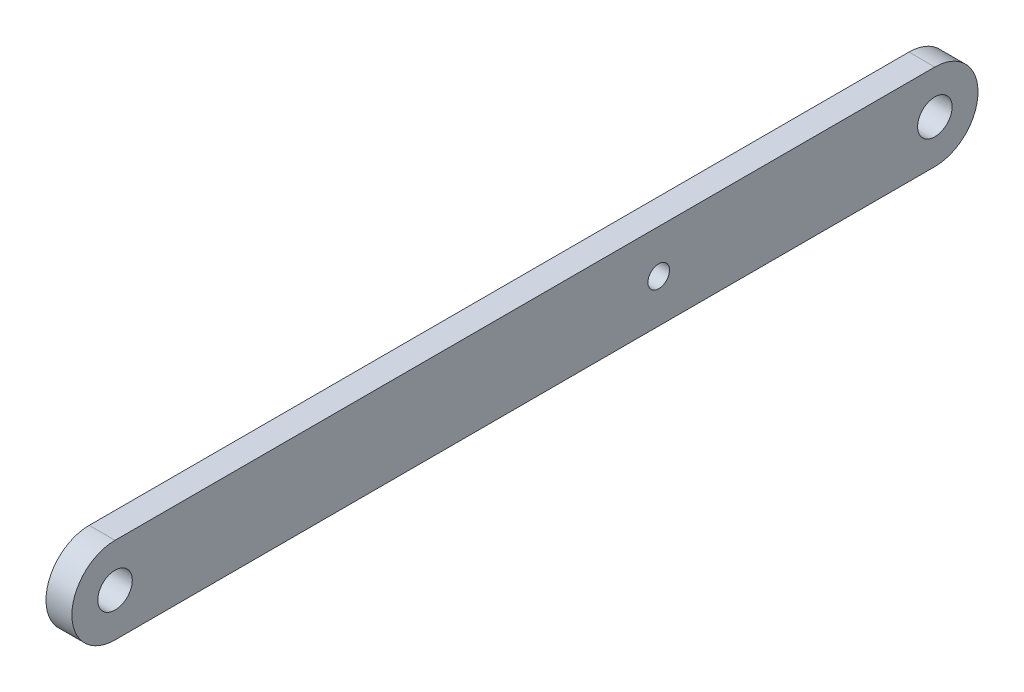
ISO-10303-21;
HEADER;
FILE_DESCRIPTION(('STEP AP214'),'2;1');
FILE_NAME('part.step','',(''),(''),'','','');
FILE_SCHEMA(('AUTOMOTIVE_DESIGN { 1 0 10303 214 1 1 1 1 }'));
ENDSEC;
DATA;
#1=APPLICATION_CONTEXT('core data for automotive mechanical design processes');
#2=APPLICATION_PROTOCOL_DEFINITION('international standard','automotive_design',2000,#1);
#3=PRODUCT_CONTEXT('',#1,'mechanical');
#4=PRODUCT('Part','Part','',(#3));
#5=PRODUCT_RELATED_PRODUCT_CATEGORY('part','',(#4));
#6=PRODUCT_DEFINITION_FORMATION('','',#4);
#7=PRODUCT_DEFINITION_CONTEXT('part definition',#1,'design');
#8=PRODUCT_DEFINITION('design','',#6,#7);
#9=PRODUCT_DEFINITION_SHAPE('','',#8);
#10=(LENGTH_UNIT() NAMED_UNIT(*) SI_UNIT(.MILLI.,.METRE.));
#11=(NAMED_UNIT(*) PLANE_ANGLE_UNIT() SI_UNIT($,.RADIAN.));
#12=(NAMED_UNIT(*) SI_UNIT($,.STERADIAN.) SOLID_ANGLE_UNIT());
#13=UNCERTAINTY_MEASURE_WITH_UNIT(LENGTH_MEASURE(1.E-05),#10,'distance_accuracy_value','');
#14=(GEOMETRIC_REPRESENTATION_CONTEXT(3) GLOBAL_UNCERTAINTY_ASSIGNED_CONTEXT((#13)) GLOBAL_UNIT_ASSIGNED_CONTEXT((#10,
#11,#12)) REPRESENTATION_CONTEXT('',''));
#15=CARTESIAN_POINT('',(0.,0.,0.));
#16=DIRECTION('',(0.,0.,1.));
#17=DIRECTION('',(1.,0.,0.));
#18=AXIS2_PLACEMENT_3D('',#15,#16,#17);
#19=CARTESIAN_POINT('',(3.,4.99999999999999,0.));
#20=DIRECTION('',(1.,0.,0.));
#21=DIRECTION('',(0.,0.,-1.));
#22=AXIS2_PLACEMENT_3D('',#19,#20,#21);
#23=PLANE('',#22);
#24=CARTESIAN_POINT('',(3.,4.99999999999999,0.));
#25=DIRECTION('',(1.,0.,0.));
#26=DIRECTION('',(0.,0.,-1.));
#27=AXIS2_PLACEMENT_3D('',#24,#25,#26);
#28=CIRCLE('',#27,2.);
#29=CARTESIAN_POINT('',(3.,4.99999999999999,-2.));
#30=VERTEX_POINT('',#29);
#31=EDGE_CURVE('E145',#30,#30,#28,.T.);
#32=ORIENTED_EDGE('',*,*,#31,.F.);
#33=EDGE_LOOP('',(#32));
#34=FACE_BOUND('',#33,.T.);
#35=CARTESIAN_POINT('',(3.,4.99999999999999,0.));
#36=DIRECTION('',(1.,0.,0.));
#37=DIRECTION('',(0.,0.,-1.));
#38=AXIS2_PLACEMENT_3D('',#35,#36,#37);
#39=CIRCLE('',#38,5.);
#40=CARTESIAN_POINT('',(3.,10.,0.));
#41=VERTEX_POINT('',#40);
#42=CARTESIAN_POINT('',(3.,0.,0.));
#43=VERTEX_POINT('',#42);
#44=EDGE_CURVE('E101',#41,#43,#39,.T.);
#45=ORIENTED_EDGE('',*,*,#44,.T.);
#46=DIRECTION('',(0.,0.,-1.));
#47=VECTOR('',#46,1.);
#48=CARTESIAN_POINT('',(3.,0.,0.));
#49=LINE('',#48,#47);
#50=CARTESIAN_POINT('',(3.,0.,-95.));
#51=VERTEX_POINT('',#50);
#52=EDGE_CURVE('E96',#43,#51,#49,.T.);
#53=ORIENTED_EDGE('',*,*,#52,.T.);
#54=CARTESIAN_POINT('',(3.,5.,-95.));
#55=DIRECTION('',(1.,0.,0.));
#56=DIRECTION('',(0.,0.,1.));
#57=AXIS2_PLACEMENT_3D('',#54,#55,#56);
#58=CIRCLE('',#57,5.);
#59=CARTESIAN_POINT('',(3.,10.,-95.));
#60=VERTEX_POINT('',#59);
#61=EDGE_CURVE('E99',#51,#60,#58,.T.);
#62=ORIENTED_EDGE('',*,*,#61,.T.);
#63=DIRECTION('',(0.,0.,1.));
#64=VECTOR('',#63,1.);
#65=CARTESIAN_POINT('',(3.,10.,0.));
#66=LINE('',#65,#64);
#67=EDGE_CURVE('E66',#60,#41,#66,.T.);
#68=ORIENTED_EDGE('',*,*,#67,.T.);
#69=EDGE_LOOP('',(#45,#53,#62,#68));
#70=FACE_BOUND('',#69,.T.);
#71=CARTESIAN_POINT('',(3.,5.,-95.));
#72=DIRECTION('',(1.,0.,0.));
#73=DIRECTION('',(0.,0.,-1.));
#74=AXIS2_PLACEMENT_3D('',#71,#72,#73);
#75=CIRCLE('',#74,2.);
#76=CARTESIAN_POINT('',(3.,5.,-97.));
#77=VERTEX_POINT('',#76);
#78=EDGE_CURVE('E122',#77,#77,#75,.T.);
#79=ORIENTED_EDGE('',*,*,#78,.F.);
#80=EDGE_LOOP('',(#79));
#81=FACE_BOUND('',#80,.T.);
#82=CARTESIAN_POINT('',(3.,4.99999999999999,-63.));
#83=DIRECTION('',(1.,0.,0.));
#84=DIRECTION('',(0.,0.,-1.));
#85=AXIS2_PLACEMENT_3D('',#82,#83,#84);
#86=CIRCLE('',#85,1.25);
#87=CARTESIAN_POINT('',(3.,4.99999999999999,-64.25));
#88=VERTEX_POINT('',#87);
#89=EDGE_CURVE('E152',#88,#88,#86,.T.);
#90=ORIENTED_EDGE('',*,*,#89,.F.);
#91=EDGE_LOOP('',(#90));
#92=FACE_BOUND('',#91,.T.);
#93=ADVANCED_FACE('F48',(#34,#70,#81,#92),#23,.T.);
#94=CARTESIAN_POINT('',(0.,4.99999999999999,0.));
#95=DIRECTION('',(1.,0.,0.));
#96=DIRECTION('',(0.,0.,-1.));
#97=AXIS2_PLACEMENT_3D('',#94,#95,#96);
#98=PLANE('',#97);
#99=CARTESIAN_POINT('',(0.,4.99999999999999,0.));
#100=DIRECTION('',(1.,0.,0.));
#101=DIRECTION('',(0.,0.,-1.));
#102=AXIS2_PLACEMENT_3D('',#99,#100,#101);
#103=CIRCLE('',#102,5.);
#104=CARTESIAN_POINT('',(0.,10.,0.));
#105=VERTEX_POINT('',#104);
#106=CARTESIAN_POINT('',(0.,0.,0.));
#107=VERTEX_POINT('',#106);
#108=EDGE_CURVE('E119',#105,#107,#103,.T.);
#109=ORIENTED_EDGE('',*,*,#108,.F.);
#110=DIRECTION('',(0.,0.,1.));
#111=VECTOR('',#110,1.);
#112=CARTESIAN_POINT('',(0.,10.,0.));
#113=LINE('',#112,#111);
#114=CARTESIAN_POINT('',(0.,10.,-95.));
#115=VERTEX_POINT('',#114);
#116=EDGE_CURVE('E89',#115,#105,#113,.T.);
#117=ORIENTED_EDGE('',*,*,#116,.F.);
#118=CARTESIAN_POINT('',(0.,5.,-95.));
#119=DIRECTION('',(1.,0.,0.));
#120=DIRECTION('',(0.,0.,1.));
#121=AXIS2_PLACEMENT_3D('',#118,#119,#120);
#122=CIRCLE('',#121,5.);
#123=CARTESIAN_POINT('',(0.,0.,-95.));
#124=VERTEX_POINT('',#123);
#125=EDGE_CURVE('E83',#124,#115,#122,.T.);
#126=ORIENTED_EDGE('',*,*,#125,.F.);
#127=DIRECTION('',(0.,0.,-1.));
#128=VECTOR('',#127,1.);
#129=CARTESIAN_POINT('',(0.,0.,0.));
#130=LINE('',#129,#128);
#131=EDGE_CURVE('E106',#107,#124,#130,.T.);
#132=ORIENTED_EDGE('',*,*,#131,.F.);
#133=EDGE_LOOP('',(#109,#117,#126,#132));
#134=FACE_BOUND('',#133,.T.);
#135=CARTESIAN_POINT('',(0.,5.,-95.));
#136=DIRECTION('',(1.,0.,0.));
#137=DIRECTION('',(0.,0.,-1.));
#138=AXIS2_PLACEMENT_3D('',#135,#136,#137);
#139=CIRCLE('',#138,2.);
#140=CARTESIAN_POINT('',(0.,5.,-97.));
#141=VERTEX_POINT('',#140);
#142=EDGE_CURVE('E141',#141,#141,#139,.T.);
#143=ORIENTED_EDGE('',*,*,#142,.T.);
#144=EDGE_LOOP('',(#143));
#145=FACE_BOUND('',#144,.T.);
#146=CARTESIAN_POINT('',(0.,4.99999999999999,0.));
#147=DIRECTION('',(1.,0.,0.));
#148=DIRECTION('',(0.,0.,-1.));
#149=AXIS2_PLACEMENT_3D('',#146,#147,#148);
#150=CIRCLE('',#149,2.);
#151=CARTESIAN_POINT('',(0.,4.99999999999999,-2.));
#152=VERTEX_POINT('',#151);
#153=EDGE_CURVE('E149',#152,#152,#150,.T.);
#154=ORIENTED_EDGE('',*,*,#153,.T.);
#155=EDGE_LOOP('',(#154));
#156=FACE_BOUND('',#155,.T.);
#157=CARTESIAN_POINT('',(0.,4.99999999999999,-63.));
#158=DIRECTION('',(1.,0.,0.));
#159=DIRECTION('',(0.,0.,-1.));
#160=AXIS2_PLACEMENT_3D('',#157,#158,#159);
#161=CIRCLE('',#160,1.25);
#162=CARTESIAN_POINT('',(0.,4.99999999999999,-64.25));
#163=VERTEX_POINT('',#162);
#164=EDGE_CURVE('E156',#163,#163,#161,.T.);
#165=ORIENTED_EDGE('',*,*,#164,.T.);
#166=EDGE_LOOP('',(#165));
#167=FACE_BOUND('',#166,.T.);
#168=ADVANCED_FACE('F134',(#134,#145,#156,#167),#98,.F.);
#169=CARTESIAN_POINT('',(3.,4.99999999999999,0.));
#170=DIRECTION('',(-1.,0.,0.));
#171=DIRECTION('',(0.,0.,1.));
#172=AXIS2_PLACEMENT_3D('',#169,#170,#171);
#173=CYLINDRICAL_SURFACE('',#172,5.);
#174=ORIENTED_EDGE('',*,*,#108,.T.);
#175=DIRECTION('',(-1.,0.,0.));
#176=VECTOR('',#175,1.);
#177=CARTESIAN_POINT('',(3.,0.,0.));
#178=LINE('',#177,#176);
#179=EDGE_CURVE('E13',#43,#107,#178,.T.);
#180=ORIENTED_EDGE('',*,*,#179,.F.);
#181=ORIENTED_EDGE('',*,*,#44,.F.);
#182=DIRECTION('',(-1.,0.,0.));
#183=VECTOR('',#182,1.);
#184=CARTESIAN_POINT('',(3.,10.,0.));
#185=LINE('',#184,#183);
#186=EDGE_CURVE('E115',#41,#105,#185,.T.);
#187=ORIENTED_EDGE('',*,*,#186,.T.);
#188=EDGE_LOOP('',(#174,#180,#181,#187));
#189=FACE_BOUND('',#188,.T.);
#190=ADVANCED_FACE('F50',(#189),#173,.T.);
#191=CARTESIAN_POINT('',(3.,0.,0.));
#192=DIRECTION('',(0.,1.,0.));
#193=DIRECTION('',(0.,0.,1.));
#194=AXIS2_PLACEMENT_3D('',#191,#192,#193);
#195=PLANE('',#194);
#196=ORIENTED_EDGE('',*,*,#131,.T.);
#197=DIRECTION('',(-1.,0.,0.));
#198=VECTOR('',#197,1.);
#199=CARTESIAN_POINT('',(3.,0.,-95.));
#200=LINE('',#199,#198);
#201=EDGE_CURVE('E58',#51,#124,#200,.T.);
#202=ORIENTED_EDGE('',*,*,#201,.F.);
#203=ORIENTED_EDGE('',*,*,#52,.F.);
#204=ORIENTED_EDGE('',*,*,#179,.T.);
#205=EDGE_LOOP('',(#196,#202,#203,#204));
#206=FACE_BOUND('',#205,.T.);
#207=ADVANCED_FACE('F105',(#206),#195,.F.);
#208=CARTESIAN_POINT('',(3.,5.,-95.));
#209=DIRECTION('',(-1.,0.,0.));
#210=DIRECTION('',(0.,0.,1.));
#211=AXIS2_PLACEMENT_3D('',#208,#209,#210);
#212=CYLINDRICAL_SURFACE('',#211,5.);
#213=ORIENTED_EDGE('',*,*,#125,.T.);
#214=DIRECTION('',(-1.,0.,0.));
#215=VECTOR('',#214,1.);
#216=CARTESIAN_POINT('',(3.,10.,-95.));
#217=LINE('',#216,#215);
#218=EDGE_CURVE('E108',#60,#115,#217,.T.);
#219=ORIENTED_EDGE('',*,*,#218,.F.);
#220=ORIENTED_EDGE('',*,*,#61,.F.);
#221=ORIENTED_EDGE('',*,*,#201,.T.);
#222=EDGE_LOOP('',(#213,#219,#220,#221));
#223=FACE_BOUND('',#222,.T.);
#224=ADVANCED_FACE('F109',(#223),#212,.T.);
#225=CARTESIAN_POINT('',(3.,10.,0.));
#226=DIRECTION('',(0.,-1.,0.));
#227=DIRECTION('',(0.,0.,-1.));
#228=AXIS2_PLACEMENT_3D('',#225,#226,#227);
#229=PLANE('',#228);
#230=ORIENTED_EDGE('',*,*,#116,.T.);
#231=ORIENTED_EDGE('',*,*,#186,.F.);
#232=ORIENTED_EDGE('',*,*,#67,.F.);
#233=ORIENTED_EDGE('',*,*,#218,.T.);
#234=EDGE_LOOP('',(#230,#231,#232,#233));
#235=FACE_BOUND('',#234,.T.);
#236=ADVANCED_FACE('F131',(#235),#229,.F.);
#237=CARTESIAN_POINT('',(3.,5.,-95.));
#238=DIRECTION('',(-1.,0.,0.));
#239=DIRECTION('',(0.,0.,1.));
#240=AXIS2_PLACEMENT_3D('',#237,#238,#239);
#241=CYLINDRICAL_SURFACE('',#240,2.);
#242=ORIENTED_EDGE('',*,*,#78,.T.);
#243=EDGE_LOOP('',(#242));
#244=FACE_BOUND('',#243,.T.);
#245=ORIENTED_EDGE('',*,*,#142,.F.);
#246=EDGE_LOOP('',(#245));
#247=FACE_BOUND('',#246,.T.);
#248=ADVANCED_FACE('F175',(#244,#247),#241,.F.);
#249=CARTESIAN_POINT('',(3.,4.99999999999999,0.));
#250=DIRECTION('',(-1.,0.,0.));
#251=DIRECTION('',(0.,0.,1.));
#252=AXIS2_PLACEMENT_3D('',#249,#250,#251);
#253=CYLINDRICAL_SURFACE('',#252,2.);
#254=ORIENTED_EDGE('',*,*,#31,.T.);
#255=EDGE_LOOP('',(#254));
#256=FACE_BOUND('',#255,.T.);
#257=ORIENTED_EDGE('',*,*,#153,.F.);
#258=EDGE_LOOP('',(#257));
#259=FACE_BOUND('',#258,.T.);
#260=ADVANCED_FACE('F227',(#256,#259),#253,.F.);
#261=CARTESIAN_POINT('',(3.,4.99999999999999,-63.));
#262=DIRECTION('',(-1.,0.,0.));
#263=DIRECTION('',(0.,0.,1.));
#264=AXIS2_PLACEMENT_3D('',#261,#262,#263);
#265=CYLINDRICAL_SURFACE('',#264,1.25);
#266=ORIENTED_EDGE('',*,*,#89,.T.);
#267=EDGE_LOOP('',(#266));
#268=FACE_BOUND('',#267,.T.);
#269=ORIENTED_EDGE('',*,*,#164,.F.);
#270=EDGE_LOOP('',(#269));
#271=FACE_BOUND('',#270,.T.);
#272=ADVANCED_FACE('F163',(#268,#271),#265,.F.);
#273=CLOSED_SHELL('',(#93,#168,#190,#207,#224,#236,#248,#260,#272));
#274=MANIFOLD_SOLID_BREP('B2',#273);
#275=ADVANCED_BREP_SHAPE_REPRESENTATION('',(#18,#274),#14);
#276=SHAPE_DEFINITION_REPRESENTATION(#9,#275);
ENDSEC;
END-ISO-10303-21;
